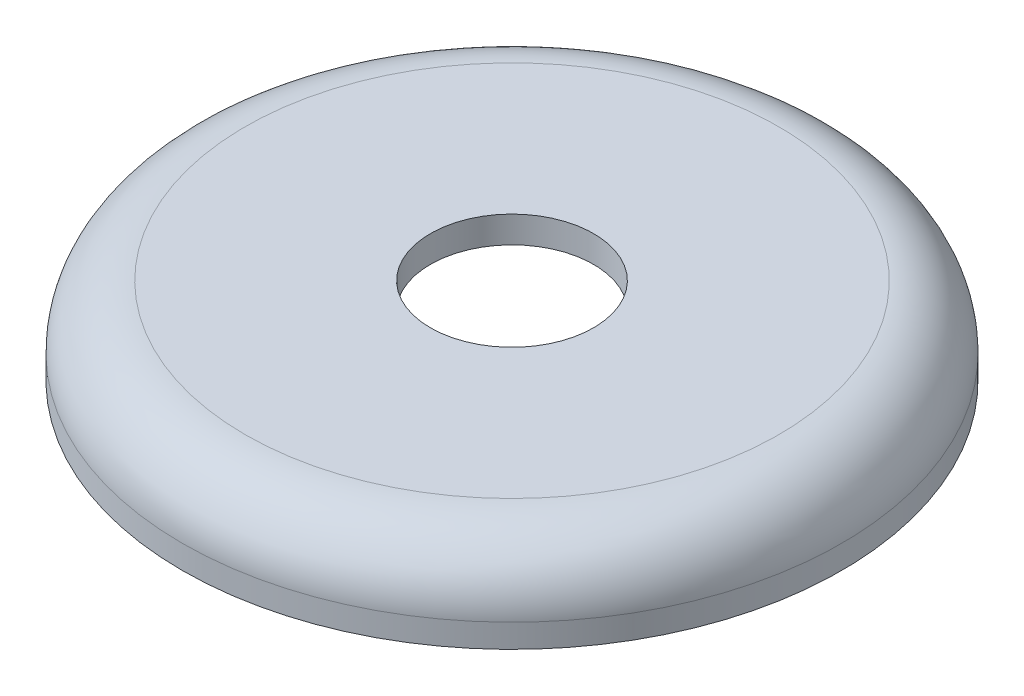
ISO-10303-21;
HEADER;
FILE_DESCRIPTION(('STEP AP214'),'2;1');
FILE_NAME('part.step','',(''),(''),'','','');
FILE_SCHEMA(('AUTOMOTIVE_DESIGN { 1 0 10303 214 1 1 1 1 }'));
ENDSEC;
DATA;
#1=APPLICATION_CONTEXT('core data for automotive mechanical design processes');
#2=APPLICATION_PROTOCOL_DEFINITION('international standard','automotive_design',2000,#1);
#3=PRODUCT_CONTEXT('',#1,'mechanical');
#4=PRODUCT('Part','Part','',(#3));
#5=PRODUCT_RELATED_PRODUCT_CATEGORY('part','',(#4));
#6=PRODUCT_DEFINITION_FORMATION('','',#4);
#7=PRODUCT_DEFINITION_CONTEXT('part definition',#1,'design');
#8=PRODUCT_DEFINITION('design','',#6,#7);
#9=PRODUCT_DEFINITION_SHAPE('','',#8);
#10=(LENGTH_UNIT() NAMED_UNIT(*) SI_UNIT(.MILLI.,.METRE.));
#11=(NAMED_UNIT(*) PLANE_ANGLE_UNIT() SI_UNIT($,.RADIAN.));
#12=(NAMED_UNIT(*) SI_UNIT($,.STERADIAN.) SOLID_ANGLE_UNIT());
#13=UNCERTAINTY_MEASURE_WITH_UNIT(LENGTH_MEASURE(1.E-05),#10,'distance_accuracy_value','');
#14=(GEOMETRIC_REPRESENTATION_CONTEXT(3) GLOBAL_UNCERTAINTY_ASSIGNED_CONTEXT((#13)) GLOBAL_UNIT_ASSIGNED_CONTEXT((#10,
#11,#12)) REPRESENTATION_CONTEXT('',''));
#15=CARTESIAN_POINT('',(0.,0.,0.));
#16=DIRECTION('',(0.,0.,1.));
#17=DIRECTION('',(1.,0.,0.));
#18=AXIS2_PLACEMENT_3D('',#15,#16,#17);
#19=CARTESIAN_POINT('',(0.,5.5,0.));
#20=DIRECTION('',(0.,-1.,0.));
#21=DIRECTION('',(0.,0.,-1.));
#22=AXIS2_PLACEMENT_3D('',#19,#20,#21);
#23=CYLINDRICAL_SURFACE('',#22,21.);
#24=CARTESIAN_POINT('',(0.,1.5,0.));
#25=DIRECTION('',(0.,1.,0.));
#26=DIRECTION('',(0.,0.,1.));
#27=AXIS2_PLACEMENT_3D('',#24,#25,#26);
#28=CIRCLE('',#27,21.);
#29=CARTESIAN_POINT('',(0.,1.5,21.));
#30=VERTEX_POINT('',#29);
#31=EDGE_CURVE('E10',#30,#30,#28,.F.);
#32=ORIENTED_EDGE('',*,*,#31,.T.);
#33=EDGE_LOOP('',(#32));
#34=FACE_BOUND('',#33,.T.);
#35=CARTESIAN_POINT('',(0.,0.,0.));
#36=DIRECTION('',(0.,1.,0.));
#37=DIRECTION('',(0.,0.,1.));
#38=AXIS2_PLACEMENT_3D('',#35,#36,#37);
#39=CIRCLE('',#38,21.);
#40=CARTESIAN_POINT('',(0.,0.,21.));
#41=VERTEX_POINT('',#40);
#42=EDGE_CURVE('E51',#41,#41,#39,.T.);
#43=ORIENTED_EDGE('',*,*,#42,.T.);
#44=EDGE_LOOP('',(#43));
#45=FACE_BOUND('',#44,.T.);
#46=ADVANCED_FACE('F39',(#34,#45),#23,.T.);
#47=CARTESIAN_POINT('',(0.,5.5,0.));
#48=DIRECTION('',(0.,1.,0.));
#49=DIRECTION('',(0.,0.,1.));
#50=AXIS2_PLACEMENT_3D('',#47,#48,#49);
#51=PLANE('',#50);
#52=CARTESIAN_POINT('',(0.,5.5,0.));
#53=DIRECTION('',(0.,1.,0.));
#54=DIRECTION('',(0.,0.,1.));
#55=AXIS2_PLACEMENT_3D('',#52,#53,#54);
#56=CIRCLE('',#55,5.2);
#57=CARTESIAN_POINT('',(0.,5.5,5.2));
#58=VERTEX_POINT('',#57);
#59=EDGE_CURVE('E65',#58,#58,#56,.T.);
#60=ORIENTED_EDGE('',*,*,#59,.F.);
#61=EDGE_LOOP('',(#60));
#62=FACE_BOUND('',#61,.T.);
#63=CARTESIAN_POINT('',(0.,5.5,0.));
#64=DIRECTION('',(0.,1.,0.));
#65=DIRECTION('',(0.,0.,1.));
#66=AXIS2_PLACEMENT_3D('',#63,#64,#65);
#67=CIRCLE('',#66,17.);
#68=CARTESIAN_POINT('',(0.,5.5,17.));
#69=VERTEX_POINT('',#68);
#70=EDGE_CURVE('E47',#69,#69,#67,.T.);
#71=ORIENTED_EDGE('',*,*,#70,.T.);
#72=EDGE_LOOP('',(#71));
#73=FACE_BOUND('',#72,.T.);
#74=ADVANCED_FACE('F87',(#62,#73),#51,.T.);
#75=CARTESIAN_POINT('',(0.,0.,0.));
#76=DIRECTION('',(0.,1.,0.));
#77=DIRECTION('',(0.,0.,1.));
#78=AXIS2_PLACEMENT_3D('',#75,#76,#77);
#79=PLANE('',#78);
#80=CARTESIAN_POINT('',(0.,0.,0.));
#81=DIRECTION('',(0.,1.,0.));
#82=DIRECTION('',(0.,0.,1.));
#83=AXIS2_PLACEMENT_3D('',#80,#81,#82);
#84=CIRCLE('',#83,19.3);
#85=CARTESIAN_POINT('',(0.,0.,19.3));
#86=VERTEX_POINT('',#85);
#87=EDGE_CURVE('E57',#86,#86,#84,.T.);
#88=ORIENTED_EDGE('',*,*,#87,.T.);
#89=EDGE_LOOP('',(#88));
#90=FACE_BOUND('',#89,.T.);
#91=ORIENTED_EDGE('',*,*,#42,.F.);
#92=EDGE_LOOP('',(#91));
#93=FACE_BOUND('',#92,.T.);
#94=ADVANCED_FACE('F92',(#90,#93),#79,.F.);
#95=CARTESIAN_POINT('',(0.,1.5,0.));
#96=DIRECTION('',(0.,1.,0.));
#97=DIRECTION('',(0.,0.,1.));
#98=AXIS2_PLACEMENT_3D('',#95,#96,#97);
#99=TOROIDAL_SURFACE('',#98,17.,4.);
#100=ORIENTED_EDGE('',*,*,#31,.F.);
#101=EDGE_LOOP('',(#100));
#102=FACE_BOUND('',#101,.T.);
#103=ORIENTED_EDGE('',*,*,#70,.F.);
#104=EDGE_LOOP('',(#103));
#105=FACE_BOUND('',#104,.T.);
#106=ADVANCED_FACE('F41',(#102,#105),#99,.T.);
#107=CARTESIAN_POINT('',(0.,5.5,0.));
#108=DIRECTION('',(0.,-1.,0.));
#109=DIRECTION('',(0.,0.,-1.));
#110=AXIS2_PLACEMENT_3D('',#107,#108,#109);
#111=CYLINDRICAL_SURFACE('',#110,19.3);
#112=CARTESIAN_POINT('',(0.,1.5,0.));
#113=DIRECTION('',(0.,-1.,0.));
#114=DIRECTION('',(0.,0.,-1.));
#115=AXIS2_PLACEMENT_3D('',#112,#113,#114);
#116=CIRCLE('',#115,19.3);
#117=CARTESIAN_POINT('',(0.,1.5,-19.3));
#118=VERTEX_POINT('',#117);
#119=EDGE_CURVE('E56',#118,#118,#116,.T.);
#120=ORIENTED_EDGE('',*,*,#119,.F.);
#121=EDGE_LOOP('',(#120));
#122=FACE_BOUND('',#121,.T.);
#123=ORIENTED_EDGE('',*,*,#87,.F.);
#124=EDGE_LOOP('',(#123));
#125=FACE_BOUND('',#124,.T.);
#126=ADVANCED_FACE('F100',(#122,#125),#111,.F.);
#127=CARTESIAN_POINT('',(0.,3.8,0.));
#128=DIRECTION('',(0.,1.,0.));
#129=DIRECTION('',(0.,0.,1.));
#130=AXIS2_PLACEMENT_3D('',#127,#128,#129);
#131=PLANE('',#130);
#132=CARTESIAN_POINT('',(0.,3.8,0.));
#133=DIRECTION('',(0.,1.,0.));
#134=DIRECTION('',(0.,0.,1.));
#135=AXIS2_PLACEMENT_3D('',#132,#133,#134);
#136=CIRCLE('',#135,5.2);
#137=CARTESIAN_POINT('',(0.,3.8,5.2));
#138=VERTEX_POINT('',#137);
#139=EDGE_CURVE('E43',#138,#138,#136,.T.);
#140=ORIENTED_EDGE('',*,*,#139,.T.);
#141=EDGE_LOOP('',(#140));
#142=FACE_BOUND('',#141,.T.);
#143=CARTESIAN_POINT('',(0.,3.8,0.));
#144=DIRECTION('',(0.,1.,0.));
#145=DIRECTION('',(0.,0.,1.));
#146=AXIS2_PLACEMENT_3D('',#143,#144,#145);
#147=CIRCLE('',#146,17.);
#148=CARTESIAN_POINT('',(0.,3.8,17.));
#149=VERTEX_POINT('',#148);
#150=EDGE_CURVE('E60',#149,#149,#147,.T.);
#151=ORIENTED_EDGE('',*,*,#150,.F.);
#152=EDGE_LOOP('',(#151));
#153=FACE_BOUND('',#152,.T.);
#154=ADVANCED_FACE('F72',(#142,#153),#131,.F.);
#155=CARTESIAN_POINT('',(0.,1.5,0.));
#156=DIRECTION('',(0.,1.,0.));
#157=DIRECTION('',(0.,0.,1.));
#158=AXIS2_PLACEMENT_3D('',#155,#156,#157);
#159=TOROIDAL_SURFACE('',#158,17.,2.3);
#160=ORIENTED_EDGE('',*,*,#119,.T.);
#161=EDGE_LOOP('',(#160));
#162=FACE_BOUND('',#161,.T.);
#163=ORIENTED_EDGE('',*,*,#150,.T.);
#164=EDGE_LOOP('',(#163));
#165=FACE_BOUND('',#164,.T.);
#166=ADVANCED_FACE('F77',(#162,#165),#159,.F.);
#167=CARTESIAN_POINT('',(0.,0.,0.));
#168=DIRECTION('',(0.,1.,0.));
#169=DIRECTION('',(0.,0.,1.));
#170=AXIS2_PLACEMENT_3D('',#167,#168,#169);
#171=CYLINDRICAL_SURFACE('',#170,5.2);
#172=ORIENTED_EDGE('',*,*,#59,.T.);
#173=EDGE_LOOP('',(#172));
#174=FACE_BOUND('',#173,.T.);
#175=ORIENTED_EDGE('',*,*,#139,.F.);
#176=EDGE_LOOP('',(#175));
#177=FACE_BOUND('',#176,.T.);
#178=ADVANCED_FACE('F75',(#174,#177),#171,.F.);
#179=CLOSED_SHELL('',(#46,#74,#94,#106,#126,#154,#166,#178));
#180=MANIFOLD_SOLID_BREP('B2',#179);
#181=ADVANCED_BREP_SHAPE_REPRESENTATION('',(#18,#180),#14);
#182=SHAPE_DEFINITION_REPRESENTATION(#9,#181);
ENDSEC;
END-ISO-10303-21;
